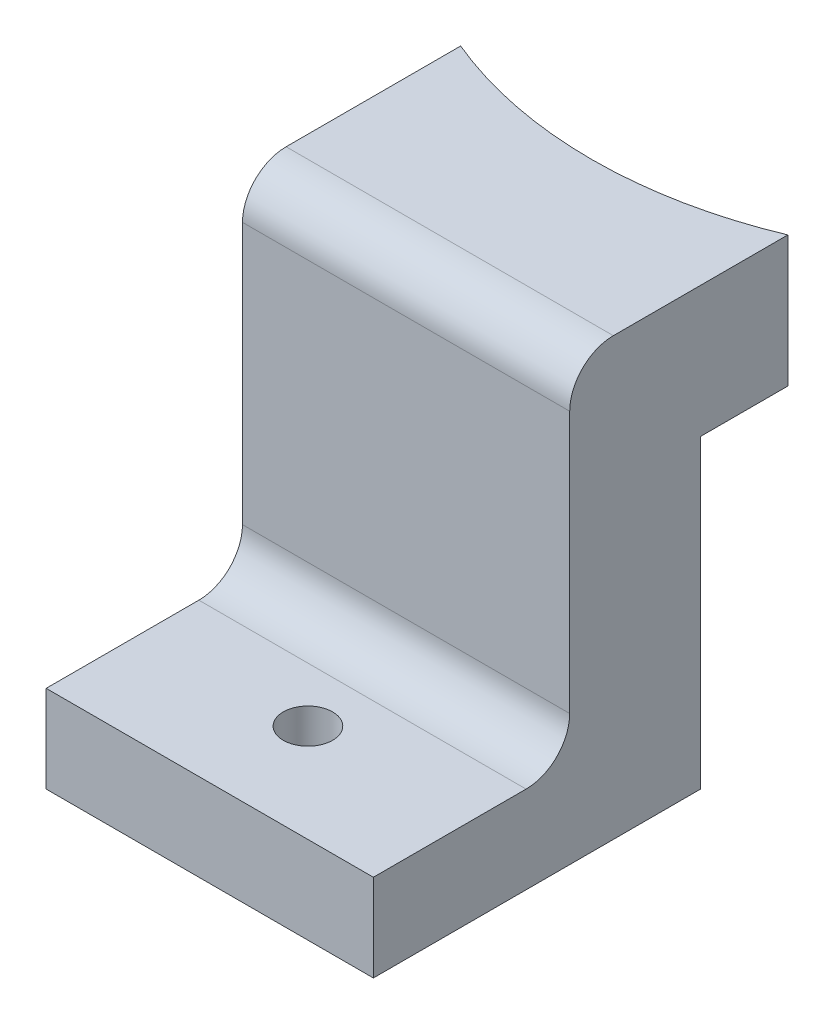
ISO-10303-21;
HEADER;
FILE_DESCRIPTION(('STEP AP214'),'2;1');
FILE_NAME('part.step','',(''),(''),'','','');
FILE_SCHEMA(('AUTOMOTIVE_DESIGN { 1 0 10303 214 1 1 1 1 }'));
ENDSEC;
DATA;
#1=APPLICATION_CONTEXT('core data for automotive mechanical design processes');
#2=APPLICATION_PROTOCOL_DEFINITION('international standard','automotive_design',2000,#1);
#3=PRODUCT_CONTEXT('',#1,'mechanical');
#4=PRODUCT('Part','Part','',(#3));
#5=PRODUCT_RELATED_PRODUCT_CATEGORY('part','',(#4));
#6=PRODUCT_DEFINITION_FORMATION('','',#4);
#7=PRODUCT_DEFINITION_CONTEXT('part definition',#1,'design');
#8=PRODUCT_DEFINITION('design','',#6,#7);
#9=PRODUCT_DEFINITION_SHAPE('','',#8);
#10=(LENGTH_UNIT() NAMED_UNIT(*) SI_UNIT(.MILLI.,.METRE.));
#11=(NAMED_UNIT(*) PLANE_ANGLE_UNIT() SI_UNIT($,.RADIAN.));
#12=(NAMED_UNIT(*) SI_UNIT($,.STERADIAN.) SOLID_ANGLE_UNIT());
#13=UNCERTAINTY_MEASURE_WITH_UNIT(LENGTH_MEASURE(1.E-05),#10,'distance_accuracy_value','');
#14=(GEOMETRIC_REPRESENTATION_CONTEXT(3) GLOBAL_UNCERTAINTY_ASSIGNED_CONTEXT((#13)) GLOBAL_UNIT_ASSIGNED_CONTEXT((#10,
#11,#12)) REPRESENTATION_CONTEXT('',''));
#15=CARTESIAN_POINT('',(0.,0.,0.));
#16=DIRECTION('',(0.,0.,1.));
#17=DIRECTION('',(1.,0.,0.));
#18=AXIS2_PLACEMENT_3D('',#15,#16,#17);
#19=CARTESIAN_POINT('',(-7.5,6.,5.));
#20=DIRECTION('',(0.,0.,-1.));
#21=DIRECTION('',(-1.,0.,0.));
#22=AXIS2_PLACEMENT_3D('',#19,#20,#21);
#23=PLANE('',#22);
#24=DIRECTION('',(0.,-1.,0.));
#25=VECTOR('',#24,1.);
#26=CARTESIAN_POINT('',(-7.5,6.,5.));
#27=LINE('',#26,#25);
#28=CARTESIAN_POINT('',(-7.5,4.,5.));
#29=VERTEX_POINT('',#28);
#30=CARTESIAN_POINT('',(-7.5,-8.,5.));
#31=VERTEX_POINT('',#30);
#32=EDGE_CURVE('E181',#29,#31,#27,.T.);
#33=ORIENTED_EDGE('',*,*,#32,.T.);
#34=DIRECTION('',(-1.,0.,0.));
#35=VECTOR('',#34,1.);
#36=CARTESIAN_POINT('',(7.5,-8.,5.));
#37=LINE('',#36,#35);
#38=CARTESIAN_POINT('',(7.5,-8.,5.));
#39=VERTEX_POINT('',#38);
#40=EDGE_CURVE('E195',#31,#39,#37,.F.);
#41=ORIENTED_EDGE('',*,*,#40,.T.);
#42=DIRECTION('',(0.,-1.,0.));
#43=VECTOR('',#42,1.);
#44=CARTESIAN_POINT('',(7.5,6.,5.));
#45=LINE('',#44,#43);
#46=CARTESIAN_POINT('',(7.5,4.,5.));
#47=VERTEX_POINT('',#46);
#48=EDGE_CURVE('E178',#47,#39,#45,.T.);
#49=ORIENTED_EDGE('',*,*,#48,.F.);
#50=DIRECTION('',(1.,0.,0.));
#51=VECTOR('',#50,1.);
#52=CARTESIAN_POINT('',(-7.5,4.,5.));
#53=LINE('',#52,#51);
#54=EDGE_CURVE('E193',#47,#29,#53,.F.);
#55=ORIENTED_EDGE('',*,*,#54,.T.);
#56=EDGE_LOOP('',(#33,#41,#49,#55));
#57=FACE_BOUND('',#56,.T.);
#58=ADVANCED_FACE('F37',(#57),#23,.F.);
#59=CARTESIAN_POINT('',(-7.5,6.,-5.));
#60=DIRECTION('',(1.,0.,0.));
#61=DIRECTION('',(0.,0.,-1.));
#62=AXIS2_PLACEMENT_3D('',#59,#60,#61);
#63=PLANE('',#62);
#64=ORIENTED_EDGE('',*,*,#32,.F.);
#65=CARTESIAN_POINT('',(-7.5,4.,3.));
#66=DIRECTION('',(1.,0.,0.));
#67=DIRECTION('',(0.,0.,-1.));
#68=AXIS2_PLACEMENT_3D('',#65,#66,#67);
#69=CIRCLE('',#68,2.);
#70=CARTESIAN_POINT('',(-7.5,6.,3.));
#71=VERTEX_POINT('',#70);
#72=EDGE_CURVE('E60',#29,#71,#69,.F.);
#73=ORIENTED_EDGE('',*,*,#72,.T.);
#74=DIRECTION('',(0.,0.,1.));
#75=VECTOR('',#74,1.);
#76=CARTESIAN_POINT('',(-7.5,6.,-5.));
#77=LINE('',#76,#75);
#78=CARTESIAN_POINT('',(-7.5,6.,-5.));
#79=VERTEX_POINT('',#78);
#80=EDGE_CURVE('E165',#79,#71,#77,.T.);
#81=ORIENTED_EDGE('',*,*,#80,.F.);
#82=DIRECTION('',(0.,-1.,0.));
#83=VECTOR('',#82,1.);
#84=CARTESIAN_POINT('',(-7.5,6.,-5.));
#85=LINE('',#84,#83);
#86=CARTESIAN_POINT('',(-7.5,0.,-5.));
#87=VERTEX_POINT('',#86);
#88=EDGE_CURVE('E170',#79,#87,#85,.T.);
#89=ORIENTED_EDGE('',*,*,#88,.T.);
#90=DIRECTION('',(0.,0.,1.));
#91=VECTOR('',#90,1.);
#92=CARTESIAN_POINT('',(-7.5,0.,-5.));
#93=LINE('',#92,#91);
#94=CARTESIAN_POINT('',(-7.5,0.,-0.999999999999998));
#95=VERTEX_POINT('',#94);
#96=EDGE_CURVE('E164',#87,#95,#93,.T.);
#97=ORIENTED_EDGE('',*,*,#96,.T.);
#98=DIRECTION('',(0.,1.,0.));
#99=VECTOR('',#98,1.);
#100=CARTESIAN_POINT('',(-7.5,-14.,-0.999999999999998));
#101=LINE('',#100,#99);
#102=CARTESIAN_POINT('',(-7.5,-14.,-0.999999999999998));
#103=VERTEX_POINT('',#102);
#104=EDGE_CURVE('E122',#103,#95,#101,.T.);
#105=ORIENTED_EDGE('',*,*,#104,.F.);
#106=DIRECTION('',(0.,0.,1.));
#107=VECTOR('',#106,1.);
#108=CARTESIAN_POINT('',(-7.5,-14.,-0.999999999999998));
#109=LINE('',#108,#107);
#110=CARTESIAN_POINT('',(-7.50000000000001,-14.,14.));
#111=VERTEX_POINT('',#110);
#112=EDGE_CURVE('E115',#103,#111,#109,.T.);
#113=ORIENTED_EDGE('',*,*,#112,.T.);
#114=DIRECTION('',(0.,-1.,0.));
#115=VECTOR('',#114,1.);
#116=CARTESIAN_POINT('',(-7.50000000000001,-10.,14.));
#117=LINE('',#116,#115);
#118=CARTESIAN_POINT('',(-7.50000000000001,-10.,14.));
#119=VERTEX_POINT('',#118);
#120=EDGE_CURVE('E120',#119,#111,#117,.T.);
#121=ORIENTED_EDGE('',*,*,#120,.F.);
#122=DIRECTION('',(0.,0.,-1.));
#123=VECTOR('',#122,1.);
#124=CARTESIAN_POINT('',(-7.50000000000001,-10.,14.));
#125=LINE('',#124,#123);
#126=CARTESIAN_POINT('',(-7.50000000000001,-10.,7.));
#127=VERTEX_POINT('',#126);
#128=EDGE_CURVE('E150',#119,#127,#125,.T.);
#129=ORIENTED_EDGE('',*,*,#128,.T.);
#130=CARTESIAN_POINT('',(-7.5,-8.,7.));
#131=DIRECTION('',(1.,0.,0.));
#132=DIRECTION('',(0.,0.,-1.));
#133=AXIS2_PLACEMENT_3D('',#130,#131,#132);
#134=CIRCLE('',#133,2.);
#135=EDGE_CURVE('E45',#127,#31,#134,.T.);
#136=ORIENTED_EDGE('',*,*,#135,.T.);
#137=EDGE_LOOP('',(#64,#73,#81,#89,#97,#105,#113,#121,#129,#136));
#138=FACE_BOUND('',#137,.T.);
#139=ADVANCED_FACE('F117',(#138),#63,.F.);
#140=CARTESIAN_POINT('',(7.5,6.,-5.));
#141=DIRECTION('',(-1.,0.,0.));
#142=DIRECTION('',(0.,0.,1.));
#143=AXIS2_PLACEMENT_3D('',#140,#141,#142);
#144=PLANE('',#143);
#145=DIRECTION('',(0.,0.,-1.));
#146=VECTOR('',#145,1.);
#147=CARTESIAN_POINT('',(7.5,6.,-5.));
#148=LINE('',#147,#146);
#149=CARTESIAN_POINT('',(7.5,6.,3.));
#150=VERTEX_POINT('',#149);
#151=CARTESIAN_POINT('',(7.5,6.,-5.));
#152=VERTEX_POINT('',#151);
#153=EDGE_CURVE('E167',#150,#152,#148,.T.);
#154=ORIENTED_EDGE('',*,*,#153,.F.);
#155=CARTESIAN_POINT('',(7.5,4.,3.));
#156=DIRECTION('',(-1.,0.,0.));
#157=DIRECTION('',(0.,0.,1.));
#158=AXIS2_PLACEMENT_3D('',#155,#156,#157);
#159=CIRCLE('',#158,2.);
#160=EDGE_CURVE('E52',#150,#47,#159,.F.);
#161=ORIENTED_EDGE('',*,*,#160,.T.);
#162=ORIENTED_EDGE('',*,*,#48,.T.);
#163=CARTESIAN_POINT('',(7.5,-8.,7.));
#164=DIRECTION('',(-1.,0.,0.));
#165=DIRECTION('',(0.,0.,1.));
#166=AXIS2_PLACEMENT_3D('',#163,#164,#165);
#167=CIRCLE('',#166,2.);
#168=CARTESIAN_POINT('',(7.5,-10.,7.));
#169=VERTEX_POINT('',#168);
#170=EDGE_CURVE('E11',#39,#169,#167,.T.);
#171=ORIENTED_EDGE('',*,*,#170,.T.);
#172=DIRECTION('',(0.,0.,-1.));
#173=VECTOR('',#172,1.);
#174=CARTESIAN_POINT('',(7.5,-10.,14.));
#175=LINE('',#174,#173);
#176=CARTESIAN_POINT('',(7.5,-10.,14.));
#177=VERTEX_POINT('',#176);
#178=EDGE_CURVE('E127',#177,#169,#175,.T.);
#179=ORIENTED_EDGE('',*,*,#178,.F.);
#180=DIRECTION('',(0.,1.,0.));
#181=VECTOR('',#180,1.);
#182=CARTESIAN_POINT('',(7.5,-10.,14.));
#183=LINE('',#182,#181);
#184=CARTESIAN_POINT('',(7.5,-14.,14.));
#185=VERTEX_POINT('',#184);
#186=EDGE_CURVE('E135',#185,#177,#183,.T.);
#187=ORIENTED_EDGE('',*,*,#186,.F.);
#188=DIRECTION('',(0.,0.,-1.));
#189=VECTOR('',#188,1.);
#190=CARTESIAN_POINT('',(7.5,-14.,-0.999999999999998));
#191=LINE('',#190,#189);
#192=CARTESIAN_POINT('',(7.5,-14.,-0.999999999999998));
#193=VERTEX_POINT('',#192);
#194=EDGE_CURVE('E126',#185,#193,#191,.T.);
#195=ORIENTED_EDGE('',*,*,#194,.T.);
#196=DIRECTION('',(0.,1.,0.));
#197=VECTOR('',#196,1.);
#198=CARTESIAN_POINT('',(7.5,-14.,-0.999999999999998));
#199=LINE('',#198,#197);
#200=CARTESIAN_POINT('',(7.5,0.,-0.999999999999998));
#201=VERTEX_POINT('',#200);
#202=EDGE_CURVE('E157',#193,#201,#199,.T.);
#203=ORIENTED_EDGE('',*,*,#202,.T.);
#204=DIRECTION('',(0.,0.,-1.));
#205=VECTOR('',#204,1.);
#206=CARTESIAN_POINT('',(7.5,0.,-5.));
#207=LINE('',#206,#205);
#208=CARTESIAN_POINT('',(7.5,0.,-5.));
#209=VERTEX_POINT('',#208);
#210=EDGE_CURVE('E168',#201,#209,#207,.T.);
#211=ORIENTED_EDGE('',*,*,#210,.T.);
#212=DIRECTION('',(0.,-1.,0.));
#213=VECTOR('',#212,1.);
#214=CARTESIAN_POINT('',(7.5,6.,-5.));
#215=LINE('',#214,#213);
#216=EDGE_CURVE('E175',#152,#209,#215,.T.);
#217=ORIENTED_EDGE('',*,*,#216,.F.);
#218=EDGE_LOOP('',(#154,#161,#162,#171,#179,#187,#195,#203,#211,#217));
#219=FACE_BOUND('',#218,.T.);
#220=ADVANCED_FACE('F210',(#219),#144,.F.);
#221=CARTESIAN_POINT('',(0.,6.,0.));
#222=DIRECTION('',(0.,1.,0.));
#223=DIRECTION('',(0.,0.,1.));
#224=AXIS2_PLACEMENT_3D('',#221,#222,#223);
#225=PLANE('',#224);
#226=ORIENTED_EDGE('',*,*,#80,.T.);
#227=DIRECTION('',(1.,0.,0.));
#228=VECTOR('',#227,1.);
#229=CARTESIAN_POINT('',(7.5,6.,3.));
#230=LINE('',#229,#228);
#231=EDGE_CURVE('E197',#71,#150,#230,.T.);
#232=ORIENTED_EDGE('',*,*,#231,.T.);
#233=ORIENTED_EDGE('',*,*,#153,.T.);
#234=CARTESIAN_POINT('',(0.,6.,-23.));
#235=DIRECTION('',(0.,1.,0.));
#236=DIRECTION('',(0.,0.,1.));
#237=AXIS2_PLACEMENT_3D('',#234,#235,#236);
#238=CIRCLE('',#237,19.5);
#239=EDGE_CURVE('E159',#79,#152,#238,.T.);
#240=ORIENTED_EDGE('',*,*,#239,.F.);
#241=EDGE_LOOP('',(#226,#232,#233,#240));
#242=FACE_BOUND('',#241,.T.);
#243=ADVANCED_FACE('F294',(#242),#225,.T.);
#244=CARTESIAN_POINT('',(0.,0.,0.));
#245=DIRECTION('',(0.,1.,0.));
#246=DIRECTION('',(0.,0.,1.));
#247=AXIS2_PLACEMENT_3D('',#244,#245,#246);
#248=PLANE('',#247);
#249=ORIENTED_EDGE('',*,*,#210,.F.);
#250=DIRECTION('',(-1.,0.,0.));
#251=VECTOR('',#250,1.);
#252=CARTESIAN_POINT('',(0.,0.,-0.999999999999998));
#253=LINE('',#252,#251);
#254=EDGE_CURVE('E187',#201,#95,#253,.T.);
#255=ORIENTED_EDGE('',*,*,#254,.T.);
#256=ORIENTED_EDGE('',*,*,#96,.F.);
#257=CARTESIAN_POINT('',(0.,0.,-23.));
#258=DIRECTION('',(0.,1.,0.));
#259=DIRECTION('',(0.,0.,1.));
#260=AXIS2_PLACEMENT_3D('',#257,#258,#259);
#261=CIRCLE('',#260,19.5);
#262=EDGE_CURVE('E184',#87,#209,#261,.T.);
#263=ORIENTED_EDGE('',*,*,#262,.T.);
#264=EDGE_LOOP('',(#249,#255,#256,#263));
#265=FACE_BOUND('',#264,.T.);
#266=ADVANCED_FACE('F302',(#265),#248,.F.);
#267=CARTESIAN_POINT('',(0.,-3.,-23.));
#268=DIRECTION('',(0.,1.,0.));
#269=DIRECTION('',(0.,0.,1.));
#270=AXIS2_PLACEMENT_3D('',#267,#268,#269);
#271=CYLINDRICAL_SURFACE('',#270,19.5);
#272=ORIENTED_EDGE('',*,*,#262,.F.);
#273=ORIENTED_EDGE('',*,*,#88,.F.);
#274=ORIENTED_EDGE('',*,*,#239,.T.);
#275=ORIENTED_EDGE('',*,*,#216,.T.);
#276=EDGE_LOOP('',(#272,#273,#274,#275));
#277=FACE_BOUND('',#276,.T.);
#278=ADVANCED_FACE('F325',(#277),#271,.F.);
#279=CARTESIAN_POINT('',(-7.5,-14.,-0.999999999999998));
#280=DIRECTION('',(0.,0.,-1.));
#281=DIRECTION('',(-1.,0.,0.));
#282=AXIS2_PLACEMENT_3D('',#279,#280,#281);
#283=PLANE('',#282);
#284=ORIENTED_EDGE('',*,*,#254,.F.);
#285=ORIENTED_EDGE('',*,*,#202,.F.);
#286=DIRECTION('',(-1.,0.,0.));
#287=VECTOR('',#286,1.);
#288=CARTESIAN_POINT('',(-7.5,-14.,-0.999999999999998));
#289=LINE('',#288,#287);
#290=EDGE_CURVE('E155',#193,#103,#289,.T.);
#291=ORIENTED_EDGE('',*,*,#290,.T.);
#292=ORIENTED_EDGE('',*,*,#104,.T.);
#293=EDGE_LOOP('',(#284,#285,#291,#292));
#294=FACE_BOUND('',#293,.T.);
#295=ADVANCED_FACE('F222',(#294),#283,.T.);
#296=CARTESIAN_POINT('',(0.,-14.,0.));
#297=DIRECTION('',(0.,1.,0.));
#298=DIRECTION('',(0.,0.,1.));
#299=AXIS2_PLACEMENT_3D('',#296,#297,#298);
#300=PLANE('',#299);
#301=CARTESIAN_POINT('',(0.,-14.,9.50000000000001));
#302=DIRECTION('',(0.,-1.,0.));
#303=DIRECTION('',(0.,0.,-1.));
#304=AXIS2_PLACEMENT_3D('',#301,#302,#303);
#305=CIRCLE('',#304,1.13029999999999);
#306=CARTESIAN_POINT('',(0.,-14.,8.36970000000002));
#307=VERTEX_POINT('',#306);
#308=EDGE_CURVE('E144',#307,#307,#305,.T.);
#309=ORIENTED_EDGE('',*,*,#308,.F.);
#310=EDGE_LOOP('',(#309));
#311=FACE_BOUND('',#310,.T.);
#312=ORIENTED_EDGE('',*,*,#112,.F.);
#313=ORIENTED_EDGE('',*,*,#290,.F.);
#314=ORIENTED_EDGE('',*,*,#194,.F.);
#315=DIRECTION('',(1.,0.,0.));
#316=VECTOR('',#315,1.);
#317=CARTESIAN_POINT('',(-7.50000000000001,-14.,14.));
#318=LINE('',#317,#316);
#319=EDGE_CURVE('E130',#111,#185,#318,.T.);
#320=ORIENTED_EDGE('',*,*,#319,.F.);
#321=EDGE_LOOP('',(#312,#313,#314,#320));
#322=FACE_BOUND('',#321,.T.);
#323=ADVANCED_FACE('F131',(#311,#322),#300,.F.);
#324=CARTESIAN_POINT('',(-7.50000000000001,-10.,14.));
#325=DIRECTION('',(0.,-1.,0.));
#326=DIRECTION('',(0.,0.,-1.));
#327=AXIS2_PLACEMENT_3D('',#324,#325,#326);
#328=PLANE('',#327);
#329=CARTESIAN_POINT('',(0.,-10.,9.50000000000001));
#330=DIRECTION('',(0.,-1.,0.));
#331=DIRECTION('',(0.,0.,-1.));
#332=AXIS2_PLACEMENT_3D('',#329,#330,#331);
#333=CIRCLE('',#332,1.13029999999999);
#334=CARTESIAN_POINT('',(0.,-10.,8.36970000000002));
#335=VERTEX_POINT('',#334);
#336=EDGE_CURVE('E141',#335,#335,#333,.T.);
#337=ORIENTED_EDGE('',*,*,#336,.T.);
#338=EDGE_LOOP('',(#337));
#339=FACE_BOUND('',#338,.T.);
#340=ORIENTED_EDGE('',*,*,#178,.T.);
#341=DIRECTION('',(-1.,0.,0.));
#342=VECTOR('',#341,1.);
#343=CARTESIAN_POINT('',(-7.50000000000001,-10.,7.));
#344=LINE('',#343,#342);
#345=EDGE_CURVE('E189',#169,#127,#344,.T.);
#346=ORIENTED_EDGE('',*,*,#345,.T.);
#347=ORIENTED_EDGE('',*,*,#128,.F.);
#348=DIRECTION('',(-1.,0.,0.));
#349=VECTOR('',#348,1.);
#350=CARTESIAN_POINT('',(-7.50000000000001,-10.,14.));
#351=LINE('',#350,#349);
#352=EDGE_CURVE('E139',#177,#119,#351,.T.);
#353=ORIENTED_EDGE('',*,*,#352,.F.);
#354=EDGE_LOOP('',(#340,#346,#347,#353));
#355=FACE_BOUND('',#354,.T.);
#356=ADVANCED_FACE('F212',(#339,#355),#328,.F.);
#357=CARTESIAN_POINT('',(0.,0.,14.));
#358=DIRECTION('',(0.,0.,1.));
#359=DIRECTION('',(1.,0.,0.));
#360=AXIS2_PLACEMENT_3D('',#357,#358,#359);
#361=PLANE('',#360);
#362=ORIENTED_EDGE('',*,*,#120,.T.);
#363=ORIENTED_EDGE('',*,*,#319,.T.);
#364=ORIENTED_EDGE('',*,*,#186,.T.);
#365=ORIENTED_EDGE('',*,*,#352,.T.);
#366=EDGE_LOOP('',(#362,#363,#364,#365));
#367=FACE_BOUND('',#366,.T.);
#368=ADVANCED_FACE('F137',(#367),#361,.T.);
#369=CARTESIAN_POINT('',(0.,-14.,9.50000000000001));
#370=DIRECTION('',(0.,-1.,0.));
#371=DIRECTION('',(0.,0.,-1.));
#372=AXIS2_PLACEMENT_3D('',#369,#370,#371);
#373=CYLINDRICAL_SURFACE('',#372,1.13029999999999);
#374=ORIENTED_EDGE('',*,*,#308,.T.);
#375=EDGE_LOOP('',(#374));
#376=FACE_BOUND('',#375,.T.);
#377=ORIENTED_EDGE('',*,*,#336,.F.);
#378=EDGE_LOOP('',(#377));
#379=FACE_BOUND('',#378,.T.);
#380=ADVANCED_FACE('F220',(#376,#379),#373,.F.);
#381=CARTESIAN_POINT('',(-7.50000000000001,-8.,7.));
#382=DIRECTION('',(1.,0.,0.));
#383=DIRECTION('',(0.,0.,-1.));
#384=AXIS2_PLACEMENT_3D('',#381,#382,#383);
#385=CYLINDRICAL_SURFACE('',#384,2.);
#386=ORIENTED_EDGE('',*,*,#170,.F.);
#387=ORIENTED_EDGE('',*,*,#40,.F.);
#388=ORIENTED_EDGE('',*,*,#135,.F.);
#389=ORIENTED_EDGE('',*,*,#345,.F.);
#390=EDGE_LOOP('',(#386,#387,#388,#389));
#391=FACE_BOUND('',#390,.T.);
#392=ADVANCED_FACE('F206',(#391),#385,.F.);
#393=CARTESIAN_POINT('',(0.,4.,3.));
#394=DIRECTION('',(-1.,0.,0.));
#395=DIRECTION('',(0.,0.,1.));
#396=AXIS2_PLACEMENT_3D('',#393,#394,#395);
#397=CYLINDRICAL_SURFACE('',#396,2.);
#398=ORIENTED_EDGE('',*,*,#72,.F.);
#399=ORIENTED_EDGE('',*,*,#54,.F.);
#400=ORIENTED_EDGE('',*,*,#160,.F.);
#401=ORIENTED_EDGE('',*,*,#231,.F.);
#402=EDGE_LOOP('',(#398,#399,#400,#401));
#403=FACE_BOUND('',#402,.T.);
#404=ADVANCED_FACE('F39',(#403),#397,.T.);
#405=CLOSED_SHELL('',(#58,#139,#220,#243,#266,#278,#295,#323,#356,#368,#380,#392,#404));
#406=MANIFOLD_SOLID_BREP('B2',#405);
#407=ADVANCED_BREP_SHAPE_REPRESENTATION('',(#18,#406),#14);
#408=SHAPE_DEFINITION_REPRESENTATION(#9,#407);
ENDSEC;
END-ISO-10303-21;
